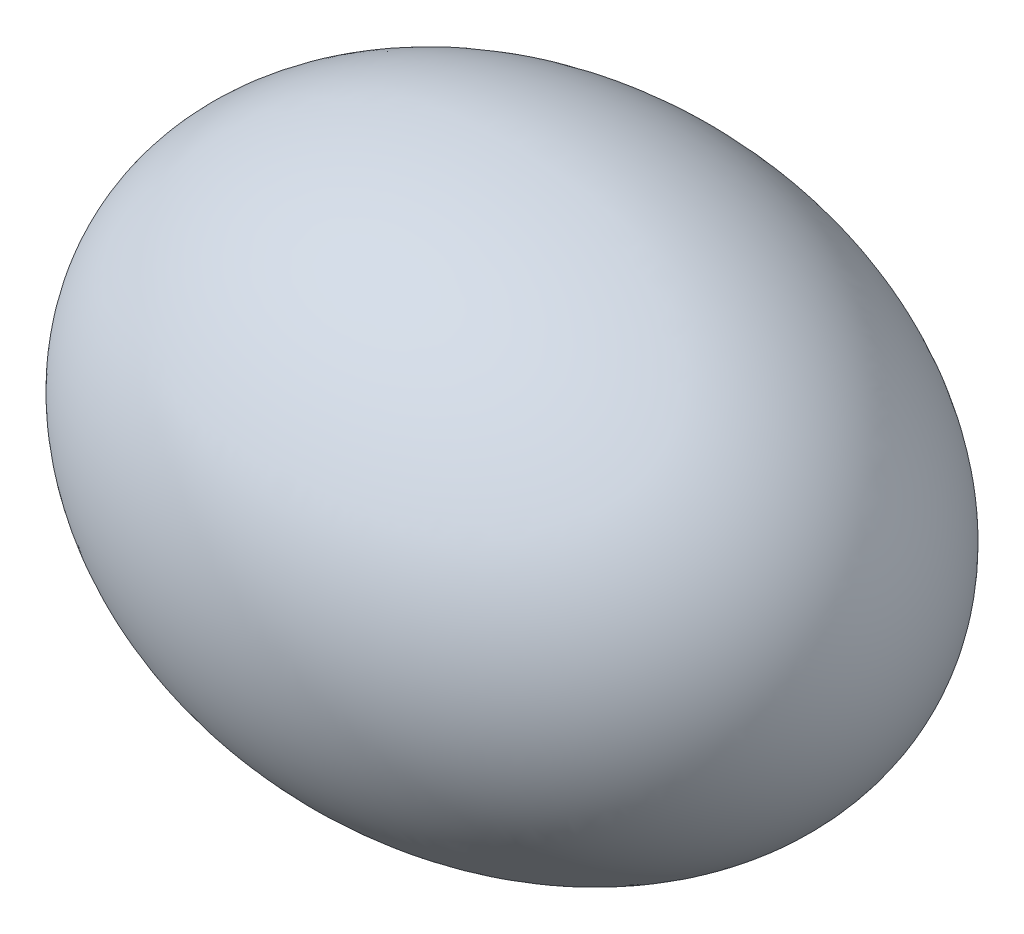
ISO-10303-21;
HEADER;
FILE_DESCRIPTION(('STEP AP214'),'2;1');
FILE_NAME('part.step','',(''),(''),'','','');
FILE_SCHEMA(('AUTOMOTIVE_DESIGN { 1 0 10303 214 1 1 1 1 }'));
ENDSEC;
DATA;
#1=APPLICATION_CONTEXT('core data for automotive mechanical design processes');
#2=APPLICATION_PROTOCOL_DEFINITION('international standard','automotive_design',2000,#1);
#3=PRODUCT_CONTEXT('',#1,'mechanical');
#4=PRODUCT('Part','Part','',(#3));
#5=PRODUCT_RELATED_PRODUCT_CATEGORY('part','',(#4));
#6=PRODUCT_DEFINITION_FORMATION('','',#4);
#7=PRODUCT_DEFINITION_CONTEXT('part definition',#1,'design');
#8=PRODUCT_DEFINITION('design','',#6,#7);
#9=PRODUCT_DEFINITION_SHAPE('','',#8);
#10=(LENGTH_UNIT() NAMED_UNIT(*) SI_UNIT(.MILLI.,.METRE.));
#11=(NAMED_UNIT(*) PLANE_ANGLE_UNIT() SI_UNIT($,.RADIAN.));
#12=(NAMED_UNIT(*) SI_UNIT($,.STERADIAN.) SOLID_ANGLE_UNIT());
#13=UNCERTAINTY_MEASURE_WITH_UNIT(LENGTH_MEASURE(1.E-05),#10,'distance_accuracy_value','');
#14=(GEOMETRIC_REPRESENTATION_CONTEXT(3) GLOBAL_UNCERTAINTY_ASSIGNED_CONTEXT((#13)) GLOBAL_UNIT_ASSIGNED_CONTEXT((#10,
#11,#12)) REPRESENTATION_CONTEXT('',''));
#15=CARTESIAN_POINT('',(0.,0.,0.));
#16=DIRECTION('',(0.,0.,1.));
#17=DIRECTION('',(1.,0.,0.));
#18=AXIS2_PLACEMENT_3D('',#15,#16,#17);
#19=CARTESIAN_POINT('',(0.,0.,0.));
#20=DIRECTION('',(0.,0.,1.));
#21=DIRECTION('',(1.,0.,0.));
#22=AXIS2_PLACEMENT_3D('',#19,#20,#21);
#23=ELLIPSE('',#22,30.,22.5);
#24=TRIMMED_CURVE('',#23,(PARAMETER_VALUE(3.14159265358979)),
(PARAMETER_VALUE(6.28318530717959)),.T.,.PARAMETER.);
#25=CARTESIAN_POINT('',(-30.,0.,0.));
#26=DIRECTION('',(-1.,0.,0.));
#27=AXIS1_PLACEMENT('',#25,#26);
#28=SURFACE_OF_REVOLUTION('',#24,#27);
#29=CARTESIAN_POINT('',(30.,0.,0.));
#30=VERTEX_POINT('',#29);
#31=VERTEX_LOOP('',#30);
#32=FACE_BOUND('',#31,.T.);
#33=CARTESIAN_POINT('',(-30.,0.,0.));
#34=VERTEX_POINT('',#33);
#35=VERTEX_LOOP('',#34);
#36=FACE_BOUND('',#35,.T.);
#37=ADVANCED_FACE('F37',(#32,#36),#28,.F.);
#38=CLOSED_SHELL('',(#37));
#39=MANIFOLD_SOLID_BREP('B2',#38);
#40=ADVANCED_BREP_SHAPE_REPRESENTATION('',(#18,#39),#14);
#41=SHAPE_DEFINITION_REPRESENTATION(#9,#40);
ENDSEC;
END-ISO-10303-21;
